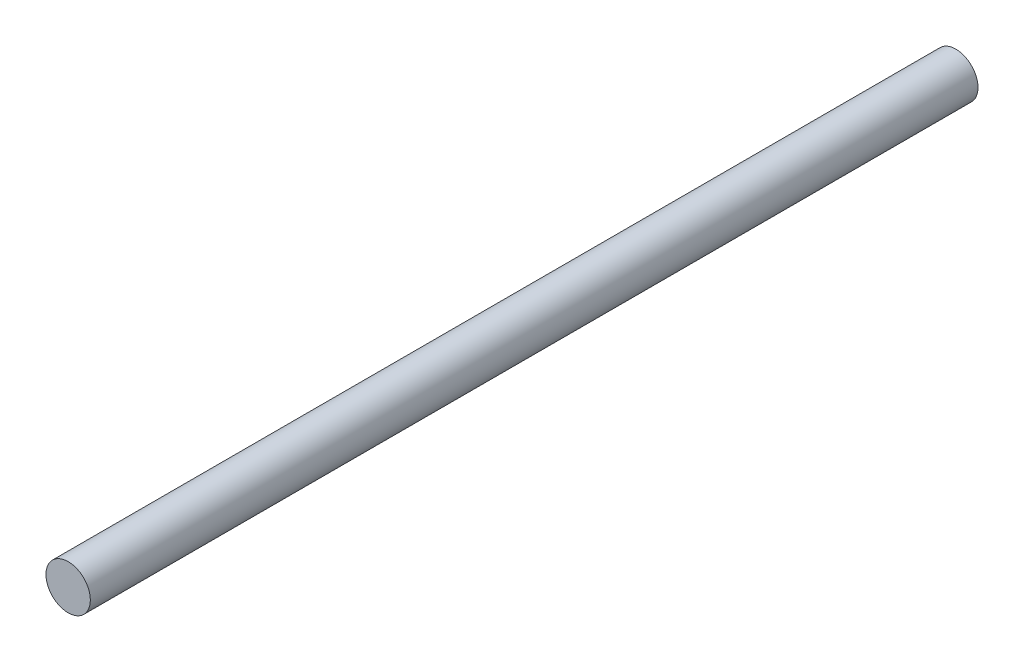
ISO-10303-21;
HEADER;
FILE_DESCRIPTION(('STEP AP214'),'2;1');
FILE_NAME('part.step','',(''),(''),'','','');
FILE_SCHEMA(('AUTOMOTIVE_DESIGN { 1 0 10303 214 1 1 1 1 }'));
ENDSEC;
DATA;
#1=APPLICATION_CONTEXT('core data for automotive mechanical design processes');
#2=APPLICATION_PROTOCOL_DEFINITION('international standard','automotive_design',2000,#1);
#3=PRODUCT_CONTEXT('',#1,'mechanical');
#4=PRODUCT('Part','Part','',(#3));
#5=PRODUCT_RELATED_PRODUCT_CATEGORY('part','',(#4));
#6=PRODUCT_DEFINITION_FORMATION('','',#4);
#7=PRODUCT_DEFINITION_CONTEXT('part definition',#1,'design');
#8=PRODUCT_DEFINITION('design','',#6,#7);
#9=PRODUCT_DEFINITION_SHAPE('','',#8);
#10=(LENGTH_UNIT() NAMED_UNIT(*) SI_UNIT(.MILLI.,.METRE.));
#11=(NAMED_UNIT(*) PLANE_ANGLE_UNIT() SI_UNIT($,.RADIAN.));
#12=(NAMED_UNIT(*) SI_UNIT($,.STERADIAN.) SOLID_ANGLE_UNIT());
#13=UNCERTAINTY_MEASURE_WITH_UNIT(LENGTH_MEASURE(1.E-05),#10,'distance_accuracy_value','');
#14=(GEOMETRIC_REPRESENTATION_CONTEXT(3) GLOBAL_UNCERTAINTY_ASSIGNED_CONTEXT((#13)) GLOBAL_UNIT_ASSIGNED_CONTEXT((#10,
#11,#12)) REPRESENTATION_CONTEXT('',''));
#15=CARTESIAN_POINT('',(0.,0.,0.));
#16=DIRECTION('',(0.,0.,1.));
#17=DIRECTION('',(1.,0.,0.));
#18=AXIS2_PLACEMENT_3D('',#15,#16,#17);
#19=CARTESIAN_POINT('',(0.,0.,400.));
#20=DIRECTION('',(0.,0.,-1.));
#21=DIRECTION('',(-1.,0.,0.));
#22=AXIS2_PLACEMENT_3D('',#19,#20,#21);
#23=CYLINDRICAL_SURFACE('',#22,10.);
#24=CARTESIAN_POINT('',(0.,0.,400.));
#25=DIRECTION('',(0.,0.,1.));
#26=DIRECTION('',(1.,0.,0.));
#27=AXIS2_PLACEMENT_3D('',#24,#25,#26);
#28=CIRCLE('',#27,10.);
#29=CARTESIAN_POINT('',(10.,0.,400.));
#30=VERTEX_POINT('',#29);
#31=EDGE_CURVE('E10',#30,#30,#28,.T.);
#32=ORIENTED_EDGE('',*,*,#31,.F.);
#33=EDGE_LOOP('',(#32));
#34=FACE_BOUND('',#33,.T.);
#35=CARTESIAN_POINT('',(0.,0.,0.));
#36=DIRECTION('',(0.,0.,1.));
#37=DIRECTION('',(1.,0.,0.));
#38=AXIS2_PLACEMENT_3D('',#35,#36,#37);
#39=CIRCLE('',#38,10.);
#40=CARTESIAN_POINT('',(10.,0.,0.));
#41=VERTEX_POINT('',#40);
#42=EDGE_CURVE('E50',#41,#41,#39,.T.);
#43=ORIENTED_EDGE('',*,*,#42,.T.);
#44=EDGE_LOOP('',(#43));
#45=FACE_BOUND('',#44,.T.);
#46=ADVANCED_FACE('F47',(#34,#45),#23,.T.);
#47=CARTESIAN_POINT('',(0.,0.,400.));
#48=DIRECTION('',(0.,0.,1.));
#49=DIRECTION('',(1.,0.,0.));
#50=AXIS2_PLACEMENT_3D('',#47,#48,#49);
#51=PLANE('',#50);
#52=ORIENTED_EDGE('',*,*,#31,.T.);
#53=EDGE_LOOP('',(#52));
#54=FACE_BOUND('',#53,.T.);
#55=ADVANCED_FACE('F62',(#54),#51,.T.);
#56=CARTESIAN_POINT('',(0.,0.,0.));
#57=DIRECTION('',(0.,0.,1.));
#58=DIRECTION('',(1.,0.,0.));
#59=AXIS2_PLACEMENT_3D('',#56,#57,#58);
#60=PLANE('',#59);
#61=ORIENTED_EDGE('',*,*,#42,.F.);
#62=EDGE_LOOP('',(#61));
#63=FACE_BOUND('',#62,.T.);
#64=ADVANCED_FACE('F60',(#63),#60,.F.);
#65=CLOSED_SHELL('',(#46,#55,#64));
#66=MANIFOLD_SOLID_BREP('B2',#65);
#67=ADVANCED_BREP_SHAPE_REPRESENTATION('',(#18,#66),#14);
#68=SHAPE_DEFINITION_REPRESENTATION(#9,#67);
ENDSEC;
END-ISO-10303-21;
